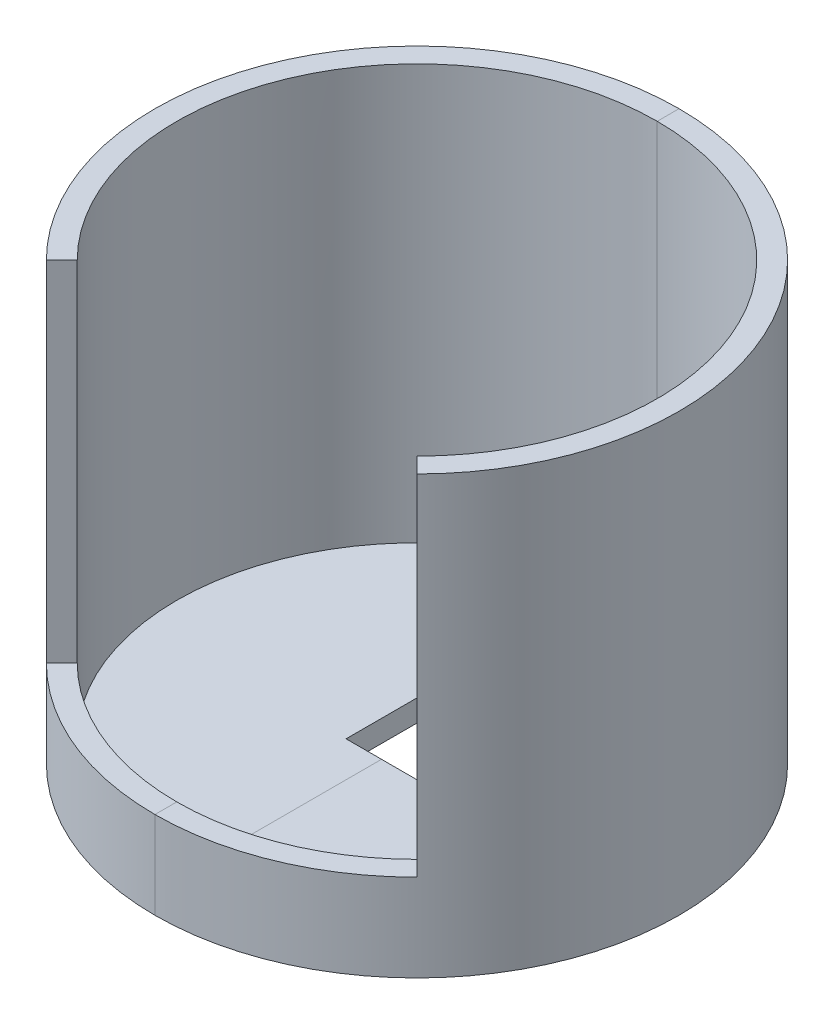
ISO-10303-21;
HEADER;
FILE_DESCRIPTION(('STEP AP214'),'2;1');
FILE_NAME('part.step','',(''),(''),'','','');
FILE_SCHEMA(('AUTOMOTIVE_DESIGN { 1 0 10303 214 1 1 1 1 }'));
ENDSEC;
DATA;
#1=APPLICATION_CONTEXT('core data for automotive mechanical design processes');
#2=APPLICATION_PROTOCOL_DEFINITION('international standard','automotive_design',2000,#1);
#3=PRODUCT_CONTEXT('',#1,'mechanical');
#4=PRODUCT('Part','Part','',(#3));
#5=PRODUCT_RELATED_PRODUCT_CATEGORY('part','',(#4));
#6=PRODUCT_DEFINITION_FORMATION('','',#4);
#7=PRODUCT_DEFINITION_CONTEXT('part definition',#1,'design');
#8=PRODUCT_DEFINITION('design','',#6,#7);
#9=PRODUCT_DEFINITION_SHAPE('','',#8);
#10=(LENGTH_UNIT() NAMED_UNIT(*) SI_UNIT(.MILLI.,.METRE.));
#11=(NAMED_UNIT(*) PLANE_ANGLE_UNIT() SI_UNIT($,.RADIAN.));
#12=(NAMED_UNIT(*) SI_UNIT($,.STERADIAN.) SOLID_ANGLE_UNIT());
#13=UNCERTAINTY_MEASURE_WITH_UNIT(LENGTH_MEASURE(1.E-05),#10,'distance_accuracy_value','');
#14=(GEOMETRIC_REPRESENTATION_CONTEXT(3) GLOBAL_UNCERTAINTY_ASSIGNED_CONTEXT((#13)) GLOBAL_UNIT_ASSIGNED_CONTEXT((#10,
#11,#12)) REPRESENTATION_CONTEXT('',''));
#15=CARTESIAN_POINT('',(0.,0.,0.));
#16=DIRECTION('',(0.,0.,1.));
#17=DIRECTION('',(1.,0.,0.));
#18=AXIS2_PLACEMENT_3D('',#15,#16,#17);
#19=CARTESIAN_POINT('',(0.,0.,0.));
#20=DIRECTION('',(1.,0.,0.));
#21=DIRECTION('',(0.,0.,-1.));
#22=AXIS2_PLACEMENT_3D('',#19,#20,#21);
#23=PLANE('',#22);
#24=DIRECTION('',(0.,0.,-1.));
#25=VECTOR('',#24,1.);
#26=CARTESIAN_POINT('',(0.,0.,0.));
#27=LINE('',#26,#25);
#28=CARTESIAN_POINT('',(0.,0.,-20.6375));
#29=VERTEX_POINT('',#28);
#30=CARTESIAN_POINT('',(0.,0.,-139.7));
#31=VERTEX_POINT('',#30);
#32=EDGE_CURVE('E165',#29,#31,#27,.T.);
#33=ORIENTED_EDGE('',*,*,#32,.F.);
#34=DIRECTION('',(0.,-1.,0.));
#35=VECTOR('',#34,1.);
#36=CARTESIAN_POINT('',(0.,12.7,-20.6375));
#37=LINE('',#36,#35);
#38=CARTESIAN_POINT('',(0.,12.7,-20.6375));
#39=VERTEX_POINT('',#38);
#40=EDGE_CURVE('E161',#39,#29,#37,.T.);
#41=ORIENTED_EDGE('',*,*,#40,.F.);
#42=DIRECTION('',(0.,0.,-1.));
#43=VECTOR('',#42,1.);
#44=CARTESIAN_POINT('',(0.,12.7,0.));
#45=LINE('',#44,#43);
#46=CARTESIAN_POINT('',(0.,12.7,-139.7));
#47=VERTEX_POINT('',#46);
#48=EDGE_CURVE('E81',#39,#47,#45,.T.);
#49=ORIENTED_EDGE('',*,*,#48,.T.);
#50=DIRECTION('',(0.,-1.,0.));
#51=VECTOR('',#50,1.);
#52=CARTESIAN_POINT('',(0.,12.7,-139.7));
#53=LINE('',#52,#51);
#54=EDGE_CURVE('E76',#31,#47,#53,.F.);
#55=ORIENTED_EDGE('',*,*,#54,.F.);
#56=EDGE_LOOP('',(#33,#41,#49,#55));
#57=FACE_BOUND('',#56,.T.);
#58=ADVANCED_FACE('F73',(#57),#23,.F.);
#59=CARTESIAN_POINT('',(0.,12.7,139.7));
#60=VERTEX_POINT('',#59);
#61=CARTESIAN_POINT('',(0.,12.7,20.6375));
#62=VERTEX_POINT('',#61);
#63=EDGE_CURVE('E167',#60,#62,#45,.T.);
#64=ORIENTED_EDGE('',*,*,#63,.T.);
#65=DIRECTION('',(0.,-1.,0.));
#66=VECTOR('',#65,1.);
#67=CARTESIAN_POINT('',(0.,12.7,20.6375));
#68=LINE('',#67,#66);
#69=CARTESIAN_POINT('',(0.,0.,20.6375));
#70=VERTEX_POINT('',#69);
#71=EDGE_CURVE('E14',#62,#70,#68,.T.);
#72=ORIENTED_EDGE('',*,*,#71,.T.);
#73=CARTESIAN_POINT('',(0.,0.,139.7));
#74=VERTEX_POINT('',#73);
#75=EDGE_CURVE('E89',#74,#70,#27,.T.);
#76=ORIENTED_EDGE('',*,*,#75,.F.);
#77=DIRECTION('',(0.,-1.,0.));
#78=VECTOR('',#77,1.);
#79=CARTESIAN_POINT('',(0.,12.7,139.7));
#80=LINE('',#79,#78);
#81=EDGE_CURVE('E168',#60,#74,#80,.T.);
#82=ORIENTED_EDGE('',*,*,#81,.F.);
#83=EDGE_LOOP('',(#64,#72,#76,#82));
#84=FACE_BOUND('',#83,.T.);
#85=ADVANCED_FACE('F177',(#84),#23,.F.);
#86=CARTESIAN_POINT('',(0.,12.7,0.));
#87=DIRECTION('',(0.,-1.,0.));
#88=DIRECTION('',(0.,0.,-1.));
#89=AXIS2_PLACEMENT_3D('',#86,#87,#88);
#90=CYLINDRICAL_SURFACE('',#89,139.7);
#91=CARTESIAN_POINT('',(0.,12.7,0.));
#92=DIRECTION('',(0.,1.,0.));
#93=DIRECTION('',(0.,0.,1.));
#94=AXIS2_PLACEMENT_3D('',#91,#92,#93);
#95=CIRCLE('',#94,139.7);
#96=EDGE_CURVE('E159',#60,#47,#95,.T.);
#97=ORIENTED_EDGE('',*,*,#96,.F.);
#98=ORIENTED_EDGE('',*,*,#81,.T.);
#99=CARTESIAN_POINT('',(0.,0.,0.));
#100=DIRECTION('',(0.,1.,0.));
#101=DIRECTION('',(0.,0.,1.));
#102=AXIS2_PLACEMENT_3D('',#99,#100,#101);
#103=CIRCLE('',#102,139.7);
#104=EDGE_CURVE('E154',#74,#31,#103,.T.);
#105=ORIENTED_EDGE('',*,*,#104,.T.);
#106=ORIENTED_EDGE('',*,*,#54,.T.);
#107=EDGE_LOOP('',(#97,#98,#105,#106));
#108=FACE_BOUND('',#107,.T.);
#109=ADVANCED_FACE('F175',(#108),#90,.T.);
#110=CARTESIAN_POINT('',(0.,12.7,0.));
#111=DIRECTION('',(0.,1.,0.));
#112=DIRECTION('',(0.,0.,1.));
#113=AXIS2_PLACEMENT_3D('',#110,#111,#112);
#114=PLANE('',#113);
#115=ORIENTED_EDGE('',*,*,#63,.F.);
#116=ORIENTED_EDGE('',*,*,#96,.T.);
#117=ORIENTED_EDGE('',*,*,#48,.F.);
#118=DIRECTION('',(1.,0.,0.));
#119=VECTOR('',#118,1.);
#120=CARTESIAN_POINT('',(-20.6375,12.7,-20.6375));
#121=LINE('',#120,#119);
#122=CARTESIAN_POINT('',(20.6375,12.7,-20.6375));
#123=VERTEX_POINT('',#122);
#124=EDGE_CURVE('E126',#39,#123,#121,.T.);
#125=ORIENTED_EDGE('',*,*,#124,.T.);
#126=DIRECTION('',(0.,0.,-1.));
#127=VECTOR('',#126,1.);
#128=CARTESIAN_POINT('',(20.6375,12.7,20.6375));
#129=LINE('',#128,#127);
#130=CARTESIAN_POINT('',(20.6375,12.7,20.6375));
#131=VERTEX_POINT('',#130);
#132=EDGE_CURVE('E131',#131,#123,#129,.T.);
#133=ORIENTED_EDGE('',*,*,#132,.F.);
#134=DIRECTION('',(1.,0.,0.));
#135=VECTOR('',#134,1.);
#136=CARTESIAN_POINT('',(-20.6375,12.7,20.6375));
#137=LINE('',#136,#135);
#138=EDGE_CURVE('E148',#62,#131,#137,.T.);
#139=ORIENTED_EDGE('',*,*,#138,.F.);
#140=EDGE_LOOP('',(#115,#116,#117,#125,#133,#139));
#141=FACE_BOUND('',#140,.T.);
#142=ADVANCED_FACE('F129',(#141),#114,.T.);
#143=CARTESIAN_POINT('',(0.,0.,0.));
#144=DIRECTION('',(0.,1.,0.));
#145=DIRECTION('',(0.,0.,1.));
#146=AXIS2_PLACEMENT_3D('',#143,#144,#145);
#147=PLANE('',#146);
#148=ORIENTED_EDGE('',*,*,#104,.F.);
#149=ORIENTED_EDGE('',*,*,#75,.T.);
#150=DIRECTION('',(1.,0.,0.));
#151=VECTOR('',#150,1.);
#152=CARTESIAN_POINT('',(-20.6375,0.,20.6375));
#153=LINE('',#152,#151);
#154=CARTESIAN_POINT('',(20.6375,0.,20.6375));
#155=VERTEX_POINT('',#154);
#156=EDGE_CURVE('E137',#70,#155,#153,.T.);
#157=ORIENTED_EDGE('',*,*,#156,.T.);
#158=DIRECTION('',(0.,0.,-1.));
#159=VECTOR('',#158,1.);
#160=CARTESIAN_POINT('',(20.6375,0.,20.6375));
#161=LINE('',#160,#159);
#162=CARTESIAN_POINT('',(20.6375,0.,-20.6375));
#163=VERTEX_POINT('',#162);
#164=EDGE_CURVE('E179',#155,#163,#161,.T.);
#165=ORIENTED_EDGE('',*,*,#164,.T.);
#166=DIRECTION('',(1.,0.,0.));
#167=VECTOR('',#166,1.);
#168=CARTESIAN_POINT('',(-20.6375,0.,-20.6375));
#169=LINE('',#168,#167);
#170=EDGE_CURVE('E152',#29,#163,#169,.T.);
#171=ORIENTED_EDGE('',*,*,#170,.F.);
#172=ORIENTED_EDGE('',*,*,#32,.T.);
#173=EDGE_LOOP('',(#148,#149,#157,#165,#171,#172));
#174=FACE_BOUND('',#173,.T.);
#175=ADVANCED_FACE('F171',(#174),#147,.F.);
#176=CARTESIAN_POINT('',(-20.6375,12.7,-20.6375));
#177=DIRECTION('',(0.,0.,-1.));
#178=DIRECTION('',(-1.,0.,0.));
#179=AXIS2_PLACEMENT_3D('',#176,#177,#178);
#180=PLANE('',#179);
#181=ORIENTED_EDGE('',*,*,#124,.F.);
#182=ORIENTED_EDGE('',*,*,#40,.T.);
#183=ORIENTED_EDGE('',*,*,#170,.T.);
#184=DIRECTION('',(0.,-1.,0.));
#185=VECTOR('',#184,1.);
#186=CARTESIAN_POINT('',(20.6375,12.7,-20.6375));
#187=LINE('',#186,#185);
#188=EDGE_CURVE('E144',#123,#163,#187,.T.);
#189=ORIENTED_EDGE('',*,*,#188,.F.);
#190=EDGE_LOOP('',(#181,#182,#183,#189));
#191=FACE_BOUND('',#190,.T.);
#192=ADVANCED_FACE('F150',(#191),#180,.F.);
#193=CARTESIAN_POINT('',(-20.6375,12.7,20.6375));
#194=DIRECTION('',(0.,0.,-1.));
#195=DIRECTION('',(-1.,0.,0.));
#196=AXIS2_PLACEMENT_3D('',#193,#194,#195);
#197=PLANE('',#196);
#198=ORIENTED_EDGE('',*,*,#71,.F.);
#199=ORIENTED_EDGE('',*,*,#138,.T.);
#200=DIRECTION('',(0.,-1.,0.));
#201=VECTOR('',#200,1.);
#202=CARTESIAN_POINT('',(20.6375,12.7,20.6375));
#203=LINE('',#202,#201);
#204=EDGE_CURVE('E147',#131,#155,#203,.T.);
#205=ORIENTED_EDGE('',*,*,#204,.T.);
#206=ORIENTED_EDGE('',*,*,#156,.F.);
#207=EDGE_LOOP('',(#198,#199,#205,#206));
#208=FACE_BOUND('',#207,.T.);
#209=ADVANCED_FACE('F178',(#208),#197,.T.);
#210=CARTESIAN_POINT('',(20.6375,12.7,20.6375));
#211=DIRECTION('',(-1.,0.,0.));
#212=DIRECTION('',(0.,0.,1.));
#213=AXIS2_PLACEMENT_3D('',#210,#211,#212);
#214=PLANE('',#213);
#215=ORIENTED_EDGE('',*,*,#164,.F.);
#216=ORIENTED_EDGE('',*,*,#204,.F.);
#217=ORIENTED_EDGE('',*,*,#132,.T.);
#218=ORIENTED_EDGE('',*,*,#188,.T.);
#219=EDGE_LOOP('',(#215,#216,#217,#218));
#220=FACE_BOUND('',#219,.T.);
#221=ADVANCED_FACE('F143',(#220),#214,.T.);
#222=CLOSED_SHELL('',(#58,#85,#109,#142,#175,#192,#209,#221));
#223=MANIFOLD_SOLID_BREP('B2',#222);
#224=CARTESIAN_POINT('',(0.,0.,0.));
#225=DIRECTION('',(1.,0.,0.));
#226=DIRECTION('',(0.,0.,-1.));
#227=AXIS2_PLACEMENT_3D('',#224,#225,#226);
#228=PLANE('',#227);
#229=DIRECTION('',(0.,0.,-1.));
#230=VECTOR('',#229,1.);
#231=CARTESIAN_POINT('',(0.,0.,107.830177644923));
#232=LINE('',#231,#230);
#233=CARTESIAN_POINT('',(0.,0.,152.494899658551));
#234=VERTEX_POINT('',#233);
#235=CARTESIAN_POINT('',(0.,0.,139.794899658551));
#236=VERTEX_POINT('',#235);
#237=EDGE_CURVE('E346',#234,#236,#232,.T.);
#238=ORIENTED_EDGE('',*,*,#237,.F.);
#239=DIRECTION('',(0.,-1.,0.));
#240=VECTOR('',#239,1.);
#241=CARTESIAN_POINT('',(0.,0.,152.494899658551));
#242=LINE('',#241,#240);
#243=CARTESIAN_POINT('',(0.,50.8,152.494899658551));
#244=VERTEX_POINT('',#243);
#245=EDGE_CURVE('E345',#234,#244,#242,.F.);
#246=ORIENTED_EDGE('',*,*,#245,.T.);
#247=DIRECTION('',(0.,0.,-1.));
#248=VECTOR('',#247,1.);
#249=CARTESIAN_POINT('',(0.,50.8,107.830177644923));
#250=LINE('',#249,#248);
#251=CARTESIAN_POINT('',(0.,50.8,139.794899658551));
#252=VERTEX_POINT('',#251);
#253=EDGE_CURVE('E259',#244,#252,#250,.T.);
#254=ORIENTED_EDGE('',*,*,#253,.T.);
#255=DIRECTION('',(0.,-1.,0.));
#256=VECTOR('',#255,1.);
#257=CARTESIAN_POINT('',(0.,0.,139.794899658551));
#258=LINE('',#257,#256);
#259=EDGE_CURVE('E254',#236,#252,#258,.F.);
#260=ORIENTED_EDGE('',*,*,#259,.F.);
#261=EDGE_LOOP('',(#238,#246,#254,#260));
#262=FACE_BOUND('',#261,.T.);
#263=ADVANCED_FACE('F251',(#262),#228,.F.);
#264=DIRECTION('',(0.,0.,-1.));
#265=VECTOR('',#264,1.);
#266=CARTESIAN_POINT('',(0.,254.,107.830177644925));
#267=LINE('',#266,#265);
#268=CARTESIAN_POINT('',(0.,254.,-139.794899658551));
#269=VERTEX_POINT('',#268);
#270=CARTESIAN_POINT('',(0.,254.,-152.494899658551));
#271=VERTEX_POINT('',#270);
#272=EDGE_CURVE('E71',#269,#271,#267,.T.);
#273=ORIENTED_EDGE('',*,*,#272,.T.);
#274=DIRECTION('',(0.,-1.,0.));
#275=VECTOR('',#274,1.);
#276=CARTESIAN_POINT('',(0.,0.,-152.494899658551));
#277=LINE('',#276,#275);
#278=CARTESIAN_POINT('',(0.,0.,-152.494899658551));
#279=VERTEX_POINT('',#278);
#280=EDGE_CURVE('E267',#271,#279,#277,.T.);
#281=ORIENTED_EDGE('',*,*,#280,.T.);
#282=CARTESIAN_POINT('',(0.,0.,-139.794899658551));
#283=VERTEX_POINT('',#282);
#284=EDGE_CURVE('E342',#283,#279,#232,.T.);
#285=ORIENTED_EDGE('',*,*,#284,.F.);
#286=DIRECTION('',(0.,-1.,0.));
#287=VECTOR('',#286,1.);
#288=CARTESIAN_POINT('',(0.,0.,-139.794899658551));
#289=LINE('',#288,#287);
#290=EDGE_CURVE('E273',#269,#283,#289,.T.);
#291=ORIENTED_EDGE('',*,*,#290,.F.);
#292=EDGE_LOOP('',(#273,#281,#285,#291));
#293=FACE_BOUND('',#292,.T.);
#294=ADVANCED_FACE('F360',(#293),#228,.F.);
#295=CARTESIAN_POINT('',(0.,0.,0.));
#296=DIRECTION('',(0.,-1.,0.));
#297=DIRECTION('',(0.,0.,-1.));
#298=AXIS2_PLACEMENT_3D('',#295,#296,#297);
#299=CYLINDRICAL_SURFACE('',#298,139.794899658551);
#300=CARTESIAN_POINT('',(0.,0.,0.));
#301=DIRECTION('',(0.,-1.,0.));
#302=DIRECTION('',(0.,0.,-1.));
#303=AXIS2_PLACEMENT_3D('',#300,#301,#302);
#304=CIRCLE('',#303,139.794899658551);
#305=EDGE_CURVE('E341',#283,#236,#304,.T.);
#306=ORIENTED_EDGE('',*,*,#305,.T.);
#307=ORIENTED_EDGE('',*,*,#259,.T.);
#308=CARTESIAN_POINT('',(0.,50.8,0.));
#309=DIRECTION('',(0.,-1.,0.));
#310=DIRECTION('',(0.,0.,-1.));
#311=AXIS2_PLACEMENT_3D('',#308,#309,#310);
#312=CIRCLE('',#311,139.794899658551);
#313=CARTESIAN_POINT('',(98.8499215238542,50.8,98.8499215238541));
#314=VERTEX_POINT('',#313);
#315=EDGE_CURVE('E320',#314,#252,#312,.T.);
#316=ORIENTED_EDGE('',*,*,#315,.F.);
#317=DIRECTION('',(0.,1.,0.));
#318=VECTOR('',#317,1.);
#319=CARTESIAN_POINT('',(98.8499215238542,0.,98.8499215238542));
#320=LINE('',#319,#318);
#321=CARTESIAN_POINT('',(98.8499215238541,254.,98.8499215238542));
#322=VERTEX_POINT('',#321);
#323=EDGE_CURVE('E316',#314,#322,#320,.T.);
#324=ORIENTED_EDGE('',*,*,#323,.T.);
#325=CARTESIAN_POINT('',(0.,254.,0.));
#326=DIRECTION('',(0.,-1.,0.));
#327=DIRECTION('',(0.,0.,-1.));
#328=AXIS2_PLACEMENT_3D('',#325,#326,#327);
#329=CIRCLE('',#328,139.794899658551);
#330=EDGE_CURVE('E305',#269,#322,#329,.T.);
#331=ORIENTED_EDGE('',*,*,#330,.F.);
#332=ORIENTED_EDGE('',*,*,#290,.T.);
#333=EDGE_LOOP('',(#306,#307,#316,#324,#331,#332));
#334=FACE_BOUND('',#333,.T.);
#335=ADVANCED_FACE('F318',(#334),#299,.F.);
#336=CARTESIAN_POINT('',(107.830177644923,0.,107.830177644923));
#337=DIRECTION('',(0.,1.,0.));
#338=DIRECTION('',(0.,0.,1.));
#339=AXIS2_PLACEMENT_3D('',#336,#337,#338);
#340=PLANE('',#339);
#341=CARTESIAN_POINT('',(0.,0.,0.));
#342=DIRECTION('',(0.,-1.,0.));
#343=DIRECTION('',(0.,0.,-1.));
#344=AXIS2_PLACEMENT_3D('',#341,#342,#343);
#345=CIRCLE('',#344,152.494899658551);
#346=EDGE_CURVE('E338',#279,#234,#345,.T.);
#347=ORIENTED_EDGE('',*,*,#346,.T.);
#348=ORIENTED_EDGE('',*,*,#237,.T.);
#349=ORIENTED_EDGE('',*,*,#305,.F.);
#350=ORIENTED_EDGE('',*,*,#284,.T.);
#351=EDGE_LOOP('',(#347,#348,#349,#350));
#352=FACE_BOUND('',#351,.T.);
#353=ADVANCED_FACE('F359',(#352),#340,.F.);
#354=CARTESIAN_POINT('',(0.,0.,0.));
#355=DIRECTION('',(0.,-1.,0.));
#356=DIRECTION('',(0.,0.,-1.));
#357=AXIS2_PLACEMENT_3D('',#354,#355,#356);
#358=CYLINDRICAL_SURFACE('',#357,152.494899658551);
#359=ORIENTED_EDGE('',*,*,#245,.F.);
#360=ORIENTED_EDGE('',*,*,#346,.F.);
#361=ORIENTED_EDGE('',*,*,#280,.F.);
#362=CARTESIAN_POINT('',(0.,254.,0.));
#363=DIRECTION('',(0.,-1.,0.));
#364=DIRECTION('',(0.,0.,-1.));
#365=AXIS2_PLACEMENT_3D('',#362,#363,#364);
#366=CIRCLE('',#365,152.494899658551);
#367=CARTESIAN_POINT('',(107.830177644923,254.,107.830177644923));
#368=VERTEX_POINT('',#367);
#369=EDGE_CURVE('E313',#271,#368,#366,.T.);
#370=ORIENTED_EDGE('',*,*,#369,.T.);
#371=DIRECTION('',(0.,1.,0.));
#372=VECTOR('',#371,1.);
#373=CARTESIAN_POINT('',(107.830177644923,0.,107.830177644923));
#374=LINE('',#373,#372);
#375=CARTESIAN_POINT('',(107.830177644923,50.8,107.830177644923));
#376=VERTEX_POINT('',#375);
#377=EDGE_CURVE('E328',#376,#368,#374,.T.);
#378=ORIENTED_EDGE('',*,*,#377,.F.);
#379=CARTESIAN_POINT('',(0.,50.8,0.));
#380=DIRECTION('',(0.,-1.,0.));
#381=DIRECTION('',(0.,0.,-1.));
#382=AXIS2_PLACEMENT_3D('',#379,#380,#381);
#383=CIRCLE('',#382,152.494899658551);
#384=EDGE_CURVE('E335',#376,#244,#383,.T.);
#385=ORIENTED_EDGE('',*,*,#384,.T.);
#386=EDGE_LOOP('',(#359,#360,#361,#370,#378,#385));
#387=FACE_BOUND('',#386,.T.);
#388=ADVANCED_FACE('F357',(#387),#358,.T.);
#389=CARTESIAN_POINT('',(107.830177644923,50.8,107.830177644923));
#390=DIRECTION('',(0.,1.,0.));
#391=DIRECTION('',(0.,0.,1.));
#392=AXIS2_PLACEMENT_3D('',#389,#390,#391);
#393=PLANE('',#392);
#394=ORIENTED_EDGE('',*,*,#253,.F.);
#395=ORIENTED_EDGE('',*,*,#384,.F.);
#396=DIRECTION('',(-0.707106781186548,0.,-0.707106781186548));
#397=VECTOR('',#396,1.);
#398=CARTESIAN_POINT('',(107.830177644923,50.8,107.830177644923));
#399=LINE('',#398,#397);
#400=EDGE_CURVE('E312',#376,#314,#399,.T.);
#401=ORIENTED_EDGE('',*,*,#400,.T.);
#402=ORIENTED_EDGE('',*,*,#315,.T.);
#403=EDGE_LOOP('',(#394,#395,#401,#402));
#404=FACE_BOUND('',#403,.T.);
#405=ADVANCED_FACE('F356',(#404),#393,.T.);
#406=CARTESIAN_POINT('',(-107.830177644922,254.,107.830177644925));
#407=DIRECTION('',(0.,1.,0.));
#408=DIRECTION('',(0.,0.,1.));
#409=AXIS2_PLACEMENT_3D('',#406,#407,#408);
#410=PLANE('',#409);
#411=ORIENTED_EDGE('',*,*,#272,.F.);
#412=ORIENTED_EDGE('',*,*,#330,.T.);
#413=DIRECTION('',(-0.707106781186548,0.,-0.707106781186548));
#414=VECTOR('',#413,1.);
#415=CARTESIAN_POINT('',(107.830177644923,254.,107.830177644923));
#416=LINE('',#415,#414);
#417=EDGE_CURVE('E310',#368,#322,#416,.T.);
#418=ORIENTED_EDGE('',*,*,#417,.F.);
#419=ORIENTED_EDGE('',*,*,#369,.F.);
#420=EDGE_LOOP('',(#411,#412,#418,#419));
#421=FACE_BOUND('',#420,.T.);
#422=ADVANCED_FACE('F307',(#421),#410,.T.);
#423=CARTESIAN_POINT('',(0.,0.,0.));
#424=DIRECTION('',(-0.707106781186548,0.,0.707106781186548));
#425=DIRECTION('',(0.707106781186548,0.,0.707106781186548));
#426=AXIS2_PLACEMENT_3D('',#423,#424,#425);
#427=PLANE('',#426);
#428=ORIENTED_EDGE('',*,*,#323,.F.);
#429=ORIENTED_EDGE('',*,*,#400,.F.);
#430=ORIENTED_EDGE('',*,*,#377,.T.);
#431=ORIENTED_EDGE('',*,*,#417,.T.);
#432=EDGE_LOOP('',(#428,#429,#430,#431));
#433=FACE_BOUND('',#432,.T.);
#434=ADVANCED_FACE('F326',(#433),#427,.T.);
#435=CLOSED_SHELL('',(#263,#294,#335,#353,#388,#405,#422,#434));
#436=MANIFOLD_SOLID_BREP('B8',#435);
#437=CARTESIAN_POINT('',(0.,0.,0.));
#438=DIRECTION('',(1.,0.,0.));
#439=DIRECTION('',(0.,0.,-1.));
#440=AXIS2_PLACEMENT_3D('',#437,#438,#439);
#441=PLANE('',#440);
#442=DIRECTION('',(0.,0.,-1.));
#443=VECTOR('',#442,1.);
#444=CARTESIAN_POINT('',(0.,0.,0.));
#445=LINE('',#444,#443);
#446=CARTESIAN_POINT('',(0.,0.,-20.6375));
#447=VERTEX_POINT('',#446);
#448=CARTESIAN_POINT('',(0.,0.,-139.7));
#449=VERTEX_POINT('',#448);
#450=EDGE_CURVE('E500',#447,#449,#445,.T.);
#451=ORIENTED_EDGE('',*,*,#450,.T.);
#452=DIRECTION('',(0.,-1.,0.));
#453=VECTOR('',#452,1.);
#454=CARTESIAN_POINT('',(0.,12.7,-139.7));
#455=LINE('',#454,#453);
#456=CARTESIAN_POINT('',(0.,12.7,-139.7));
#457=VERTEX_POINT('',#456);
#458=EDGE_CURVE('E536',#449,#457,#455,.F.);
#459=ORIENTED_EDGE('',*,*,#458,.T.);
#460=DIRECTION('',(0.,0.,-1.));
#461=VECTOR('',#460,1.);
#462=CARTESIAN_POINT('',(0.,12.7,0.));
#463=LINE('',#462,#461);
#464=CARTESIAN_POINT('',(0.,12.7,-20.6375));
#465=VERTEX_POINT('',#464);
#466=EDGE_CURVE('E510',#465,#457,#463,.T.);
#467=ORIENTED_EDGE('',*,*,#466,.F.);
#468=DIRECTION('',(0.,-1.,0.));
#469=VECTOR('',#468,1.);
#470=CARTESIAN_POINT('',(0.,12.7,-20.6375));
#471=LINE('',#470,#469);
#472=EDGE_CURVE('E496',#465,#447,#471,.T.);
#473=ORIENTED_EDGE('',*,*,#472,.T.);
#474=EDGE_LOOP('',(#451,#459,#467,#473));
#475=FACE_BOUND('',#474,.T.);
#476=ADVANCED_FACE('F438',(#475),#441,.T.);
#477=CARTESIAN_POINT('',(0.,12.7,139.7));
#478=VERTEX_POINT('',#477);
#479=CARTESIAN_POINT('',(0.,12.7,20.6375));
#480=VERTEX_POINT('',#479);
#481=EDGE_CURVE('E531',#478,#480,#463,.T.);
#482=ORIENTED_EDGE('',*,*,#481,.F.);
#483=DIRECTION('',(0.,-1.,0.));
#484=VECTOR('',#483,1.);
#485=CARTESIAN_POINT('',(0.,12.7,139.7));
#486=LINE('',#485,#484);
#487=CARTESIAN_POINT('',(0.,0.,139.7));
#488=VERTEX_POINT('',#487);
#489=EDGE_CURVE('E534',#478,#488,#486,.T.);
#490=ORIENTED_EDGE('',*,*,#489,.T.);
#491=CARTESIAN_POINT('',(0.,0.,20.6375));
#492=VERTEX_POINT('',#491);
#493=EDGE_CURVE('E507',#488,#492,#445,.T.);
#494=ORIENTED_EDGE('',*,*,#493,.T.);
#495=DIRECTION('',(0.,-1.,0.));
#496=VECTOR('',#495,1.);
#497=CARTESIAN_POINT('',(0.,12.7,20.6375));
#498=LINE('',#497,#496);
#499=EDGE_CURVE('E470',#480,#492,#498,.T.);
#500=ORIENTED_EDGE('',*,*,#499,.F.);
#501=EDGE_LOOP('',(#482,#490,#494,#500));
#502=FACE_BOUND('',#501,.T.);
#503=ADVANCED_FACE('F539',(#502),#441,.T.);
#504=CARTESIAN_POINT('',(0.,12.7,0.));
#505=DIRECTION('',(0.,-1.,0.));
#506=DIRECTION('',(0.,0.,-1.));
#507=AXIS2_PLACEMENT_3D('',#504,#505,#506);
#508=CYLINDRICAL_SURFACE('',#507,139.7);
#509=ORIENTED_EDGE('',*,*,#489,.F.);
#510=CARTESIAN_POINT('',(0.,12.7,0.));
#511=DIRECTION('',(0.,1.,0.));
#512=DIRECTION('',(0.,0.,1.));
#513=AXIS2_PLACEMENT_3D('',#510,#511,#512);
#514=CIRCLE('',#513,139.7);
#515=EDGE_CURVE('E514',#457,#478,#514,.T.);
#516=ORIENTED_EDGE('',*,*,#515,.F.);
#517=ORIENTED_EDGE('',*,*,#458,.F.);
#518=CARTESIAN_POINT('',(0.,0.,0.));
#519=DIRECTION('',(0.,1.,0.));
#520=DIRECTION('',(0.,0.,1.));
#521=AXIS2_PLACEMENT_3D('',#518,#519,#520);
#522=CIRCLE('',#521,139.7);
#523=EDGE_CURVE('E503',#449,#488,#522,.T.);
#524=ORIENTED_EDGE('',*,*,#523,.T.);
#525=EDGE_LOOP('',(#509,#516,#517,#524));
#526=FACE_BOUND('',#525,.T.);
#527=ADVANCED_FACE('F542',(#526),#508,.T.);
#528=CARTESIAN_POINT('',(-20.6375,12.7,20.6375));
#529=DIRECTION('',(-1.,0.,0.));
#530=DIRECTION('',(0.,0.,1.));
#531=AXIS2_PLACEMENT_3D('',#528,#529,#530);
#532=PLANE('',#531);
#533=DIRECTION('',(0.,0.,-1.));
#534=VECTOR('',#533,1.);
#535=CARTESIAN_POINT('',(-20.6375,0.,20.6375));
#536=LINE('',#535,#534);
#537=CARTESIAN_POINT('',(-20.6375,0.,20.6375));
#538=VERTEX_POINT('',#537);
#539=CARTESIAN_POINT('',(-20.6375,0.,-20.6375));
#540=VERTEX_POINT('',#539);
#541=EDGE_CURVE('E522',#538,#540,#536,.T.);
#542=ORIENTED_EDGE('',*,*,#541,.T.);
#543=DIRECTION('',(0.,-1.,0.));
#544=VECTOR('',#543,1.);
#545=CARTESIAN_POINT('',(-20.6375,12.7,-20.6375));
#546=LINE('',#545,#544);
#547=CARTESIAN_POINT('',(-20.6375,12.7,-20.6375));
#548=VERTEX_POINT('',#547);
#549=EDGE_CURVE('E463',#548,#540,#546,.T.);
#550=ORIENTED_EDGE('',*,*,#549,.F.);
#551=DIRECTION('',(0.,0.,-1.));
#552=VECTOR('',#551,1.);
#553=CARTESIAN_POINT('',(-20.6375,12.7,20.6375));
#554=LINE('',#553,#552);
#555=CARTESIAN_POINT('',(-20.6375,12.7,20.6375));
#556=VERTEX_POINT('',#555);
#557=EDGE_CURVE('E521',#556,#548,#554,.T.);
#558=ORIENTED_EDGE('',*,*,#557,.F.);
#559=DIRECTION('',(0.,-1.,0.));
#560=VECTOR('',#559,1.);
#561=CARTESIAN_POINT('',(-20.6375,12.7,20.6375));
#562=LINE('',#561,#560);
#563=EDGE_CURVE('E455',#556,#538,#562,.T.);
#564=ORIENTED_EDGE('',*,*,#563,.T.);
#565=EDGE_LOOP('',(#542,#550,#558,#564));
#566=FACE_BOUND('',#565,.T.);
#567=ADVANCED_FACE('F546',(#566),#532,.F.);
#568=CARTESIAN_POINT('',(0.,0.,0.));
#569=DIRECTION('',(0.,1.,0.));
#570=DIRECTION('',(0.,0.,1.));
#571=AXIS2_PLACEMENT_3D('',#568,#569,#570);
#572=PLANE('',#571);
#573=ORIENTED_EDGE('',*,*,#493,.F.);
#574=ORIENTED_EDGE('',*,*,#523,.F.);
#575=ORIENTED_EDGE('',*,*,#450,.F.);
#576=DIRECTION('',(1.,0.,0.));
#577=VECTOR('',#576,1.);
#578=CARTESIAN_POINT('',(-20.6375,0.,-20.6375));
#579=LINE('',#578,#577);
#580=EDGE_CURVE('E249',#540,#447,#579,.T.);
#581=ORIENTED_EDGE('',*,*,#580,.F.);
#582=ORIENTED_EDGE('',*,*,#541,.F.);
#583=DIRECTION('',(1.,0.,0.));
#584=VECTOR('',#583,1.);
#585=CARTESIAN_POINT('',(-20.6375,0.,20.6375));
#586=LINE('',#585,#584);
#587=EDGE_CURVE('E447',#538,#492,#586,.T.);
#588=ORIENTED_EDGE('',*,*,#587,.T.);
#589=EDGE_LOOP('',(#573,#574,#575,#581,#582,#588));
#590=FACE_BOUND('',#589,.T.);
#591=ADVANCED_FACE('F502',(#590),#572,.F.);
#592=CARTESIAN_POINT('',(0.,12.7,0.));
#593=DIRECTION('',(0.,1.,0.));
#594=DIRECTION('',(0.,0.,1.));
#595=AXIS2_PLACEMENT_3D('',#592,#593,#594);
#596=PLANE('',#595);
#597=ORIENTED_EDGE('',*,*,#515,.T.);
#598=ORIENTED_EDGE('',*,*,#481,.T.);
#599=DIRECTION('',(1.,0.,0.));
#600=VECTOR('',#599,1.);
#601=CARTESIAN_POINT('',(-20.6375,12.7,20.6375));
#602=LINE('',#601,#600);
#603=EDGE_CURVE('E518',#556,#480,#602,.T.);
#604=ORIENTED_EDGE('',*,*,#603,.F.);
#605=ORIENTED_EDGE('',*,*,#557,.T.);
#606=DIRECTION('',(1.,0.,0.));
#607=VECTOR('',#606,1.);
#608=CARTESIAN_POINT('',(-20.6375,12.7,-20.6375));
#609=LINE('',#608,#607);
#610=EDGE_CURVE('E520',#548,#465,#609,.T.);
#611=ORIENTED_EDGE('',*,*,#610,.T.);
#612=ORIENTED_EDGE('',*,*,#466,.T.);
#613=EDGE_LOOP('',(#597,#598,#604,#605,#611,#612));
#614=FACE_BOUND('',#613,.T.);
#615=ADVANCED_FACE('F544',(#614),#596,.T.);
#616=CARTESIAN_POINT('',(-20.6375,12.7,20.6375));
#617=DIRECTION('',(0.,0.,-1.));
#618=DIRECTION('',(-1.,0.,0.));
#619=AXIS2_PLACEMENT_3D('',#616,#617,#618);
#620=PLANE('',#619);
#621=ORIENTED_EDGE('',*,*,#603,.T.);
#622=ORIENTED_EDGE('',*,*,#499,.T.);
#623=ORIENTED_EDGE('',*,*,#587,.F.);
#624=ORIENTED_EDGE('',*,*,#563,.F.);
#625=EDGE_LOOP('',(#621,#622,#623,#624));
#626=FACE_BOUND('',#625,.T.);
#627=ADVANCED_FACE('F440',(#626),#620,.T.);
#628=CARTESIAN_POINT('',(-20.6375,12.7,-20.6375));
#629=DIRECTION('',(0.,0.,-1.));
#630=DIRECTION('',(-1.,0.,0.));
#631=AXIS2_PLACEMENT_3D('',#628,#629,#630);
#632=PLANE('',#631);
#633=ORIENTED_EDGE('',*,*,#472,.F.);
#634=ORIENTED_EDGE('',*,*,#610,.F.);
#635=ORIENTED_EDGE('',*,*,#549,.T.);
#636=ORIENTED_EDGE('',*,*,#580,.T.);
#637=EDGE_LOOP('',(#633,#634,#635,#636));
#638=FACE_BOUND('',#637,.T.);
#639=ADVANCED_FACE('F494',(#638),#632,.F.);
#640=CLOSED_SHELL('',(#476,#503,#527,#567,#591,#615,#627,#639));
#641=MANIFOLD_SOLID_BREP('B65',#640);
#642=CARTESIAN_POINT('',(0.,0.,0.));
#643=DIRECTION('',(1.,0.,0.));
#644=DIRECTION('',(0.,0.,-1.));
#645=AXIS2_PLACEMENT_3D('',#642,#643,#644);
#646=PLANE('',#645);
#647=DIRECTION('',(0.,0.,-1.));
#648=VECTOR('',#647,1.);
#649=CARTESIAN_POINT('',(0.,0.,107.830177644923));
#650=LINE('',#649,#648);
#651=CARTESIAN_POINT('',(0.,0.,152.494899658551));
#652=VERTEX_POINT('',#651);
#653=CARTESIAN_POINT('',(0.,0.,139.794899658551));
#654=VERTEX_POINT('',#653);
#655=EDGE_CURVE('E686',#652,#654,#650,.T.);
#656=ORIENTED_EDGE('',*,*,#655,.T.);
#657=DIRECTION('',(0.,-1.,0.));
#658=VECTOR('',#657,1.);
#659=CARTESIAN_POINT('',(0.,0.,139.794899658551));
#660=LINE('',#659,#658);
#661=CARTESIAN_POINT('',(0.,50.8,139.794899658551));
#662=VERTEX_POINT('',#661);
#663=EDGE_CURVE('E670',#654,#662,#660,.F.);
#664=ORIENTED_EDGE('',*,*,#663,.T.);
#665=DIRECTION('',(0.,0.,-1.));
#666=VECTOR('',#665,1.);
#667=CARTESIAN_POINT('',(0.,50.8,107.830177644923));
#668=LINE('',#667,#666);
#669=CARTESIAN_POINT('',(0.,50.8,152.494899658551));
#670=VERTEX_POINT('',#669);
#671=EDGE_CURVE('E718',#670,#662,#668,.T.);
#672=ORIENTED_EDGE('',*,*,#671,.F.);
#673=DIRECTION('',(0.,-1.,0.));
#674=VECTOR('',#673,1.);
#675=CARTESIAN_POINT('',(0.,0.,152.494899658551));
#676=LINE('',#675,#674);
#677=EDGE_CURVE('E724',#652,#670,#676,.F.);
#678=ORIENTED_EDGE('',*,*,#677,.F.);
#679=EDGE_LOOP('',(#656,#664,#672,#678));
#680=FACE_BOUND('',#679,.T.);
#681=ADVANCED_FACE('F606',(#680),#646,.T.);
#682=DIRECTION('',(0.,0.,-1.));
#683=VECTOR('',#682,1.);
#684=CARTESIAN_POINT('',(0.,254.,107.830177644925));
#685=LINE('',#684,#683);
#686=CARTESIAN_POINT('',(0.,254.,-139.794899658551));
#687=VERTEX_POINT('',#686);
#688=CARTESIAN_POINT('',(0.,254.,-152.494899658551));
#689=VERTEX_POINT('',#688);
#690=EDGE_CURVE('E677',#687,#689,#685,.T.);
#691=ORIENTED_EDGE('',*,*,#690,.F.);
#692=DIRECTION('',(0.,-1.,0.));
#693=VECTOR('',#692,1.);
#694=CARTESIAN_POINT('',(0.,0.,-139.794899658551));
#695=LINE('',#694,#693);
#696=CARTESIAN_POINT('',(0.,0.,-139.794899658551));
#697=VERTEX_POINT('',#696);
#698=EDGE_CURVE('E666',#687,#697,#695,.T.);
#699=ORIENTED_EDGE('',*,*,#698,.T.);
#700=CARTESIAN_POINT('',(0.,0.,-152.494899658551));
#701=VERTEX_POINT('',#700);
#702=EDGE_CURVE('E683',#697,#701,#650,.T.);
#703=ORIENTED_EDGE('',*,*,#702,.T.);
#704=DIRECTION('',(0.,-1.,0.));
#705=VECTOR('',#704,1.);
#706=CARTESIAN_POINT('',(0.,0.,-152.494899658551));
#707=LINE('',#706,#705);
#708=EDGE_CURVE('E721',#689,#701,#707,.T.);
#709=ORIENTED_EDGE('',*,*,#708,.F.);
#710=EDGE_LOOP('',(#691,#699,#703,#709));
#711=FACE_BOUND('',#710,.T.);
#712=ADVANCED_FACE('F681',(#711),#646,.T.);
#713=CARTESIAN_POINT('',(107.830177644923,0.,107.830177644923));
#714=DIRECTION('',(0.,1.,0.));
#715=DIRECTION('',(0.,0.,1.));
#716=AXIS2_PLACEMENT_3D('',#713,#714,#715);
#717=PLANE('',#716);
#718=ORIENTED_EDGE('',*,*,#655,.F.);
#719=CARTESIAN_POINT('',(0.,0.,0.));
#720=DIRECTION('',(0.,-1.,0.));
#721=DIRECTION('',(0.,0.,-1.));
#722=AXIS2_PLACEMENT_3D('',#719,#720,#721);
#723=CIRCLE('',#722,152.494899658551);
#724=EDGE_CURVE('E676',#652,#701,#723,.T.);
#725=ORIENTED_EDGE('',*,*,#724,.T.);
#726=ORIENTED_EDGE('',*,*,#702,.F.);
#727=CARTESIAN_POINT('',(0.,0.,0.));
#728=DIRECTION('',(0.,-1.,0.));
#729=DIRECTION('',(0.,0.,-1.));
#730=AXIS2_PLACEMENT_3D('',#727,#728,#729);
#731=CIRCLE('',#730,139.794899658551);
#732=EDGE_CURVE('E663',#654,#697,#731,.T.);
#733=ORIENTED_EDGE('',*,*,#732,.F.);
#734=EDGE_LOOP('',(#718,#725,#726,#733));
#735=FACE_BOUND('',#734,.T.);
#736=ADVANCED_FACE('F688',(#735),#717,.F.);
#737=CARTESIAN_POINT('',(0.,0.,0.));
#738=DIRECTION('',(-0.707106781186557,0.,-0.707106781186538));
#739=DIRECTION('',(-0.707106781186538,0.,0.707106781186557));
#740=AXIS2_PLACEMENT_3D('',#737,#738,#739);
#741=PLANE('',#740);
#742=DIRECTION('',(0.707106781186548,0.,-0.707106781186548));
#743=VECTOR('',#742,1.);
#744=CARTESIAN_POINT('',(-107.830177644923,50.8,107.830177644923));
#745=LINE('',#744,#743);
#746=CARTESIAN_POINT('',(-107.830177644922,50.8,107.830177644925));
#747=VERTEX_POINT('',#746);
#748=CARTESIAN_POINT('',(-98.8499215238528,50.8,98.8499215238555));
#749=VERTEX_POINT('',#748);
#750=EDGE_CURVE('E702',#747,#749,#745,.T.);
#751=ORIENTED_EDGE('',*,*,#750,.T.);
#752=DIRECTION('',(0.,1.,0.));
#753=VECTOR('',#752,1.);
#754=CARTESIAN_POINT('',(-98.8499215238528,0.,98.8499215238556));
#755=LINE('',#754,#753);
#756=CARTESIAN_POINT('',(-98.8499215238528,254.,98.8499215238555));
#757=VERTEX_POINT('',#756);
#758=EDGE_CURVE('E436',#749,#757,#755,.T.);
#759=ORIENTED_EDGE('',*,*,#758,.T.);
#760=DIRECTION('',(0.707106781186538,0.,-0.707106781186557));
#761=VECTOR('',#760,1.);
#762=CARTESIAN_POINT('',(-107.830177644922,254.,107.830177644925));
#763=LINE('',#762,#761);
#764=CARTESIAN_POINT('',(-107.830177644922,254.,107.830177644925));
#765=VERTEX_POINT('',#764);
#766=EDGE_CURVE('E616',#765,#757,#763,.T.);
#767=ORIENTED_EDGE('',*,*,#766,.F.);
#768=DIRECTION('',(0.,1.,0.));
#769=VECTOR('',#768,1.);
#770=CARTESIAN_POINT('',(-107.830177644922,0.,107.830177644925));
#771=LINE('',#770,#769);
#772=EDGE_CURVE('E630',#747,#765,#771,.T.);
#773=ORIENTED_EDGE('',*,*,#772,.F.);
#774=EDGE_LOOP('',(#751,#759,#767,#773));
#775=FACE_BOUND('',#774,.T.);
#776=ADVANCED_FACE('F733',(#775),#741,.F.);
#777=CARTESIAN_POINT('',(0.,0.,0.));
#778=DIRECTION('',(0.,-1.,0.));
#779=DIRECTION('',(0.,0.,-1.));
#780=AXIS2_PLACEMENT_3D('',#777,#778,#779);
#781=CYLINDRICAL_SURFACE('',#780,152.494899658551);
#782=ORIENTED_EDGE('',*,*,#724,.F.);
#783=ORIENTED_EDGE('',*,*,#677,.T.);
#784=CARTESIAN_POINT('',(0.,50.8,0.));
#785=DIRECTION('',(0.,-1.,0.));
#786=DIRECTION('',(0.,0.,-1.));
#787=AXIS2_PLACEMENT_3D('',#784,#785,#786);
#788=CIRCLE('',#787,152.494899658551);
#789=EDGE_CURVE('E697',#670,#747,#788,.T.);
#790=ORIENTED_EDGE('',*,*,#789,.T.);
#791=ORIENTED_EDGE('',*,*,#772,.T.);
#792=CARTESIAN_POINT('',(0.,254.,0.));
#793=DIRECTION('',(0.,-1.,0.));
#794=DIRECTION('',(0.,0.,-1.));
#795=AXIS2_PLACEMENT_3D('',#792,#793,#794);
#796=CIRCLE('',#795,152.494899658551);
#797=EDGE_CURVE('E610',#765,#689,#796,.T.);
#798=ORIENTED_EDGE('',*,*,#797,.T.);
#799=ORIENTED_EDGE('',*,*,#708,.T.);
#800=EDGE_LOOP('',(#782,#783,#790,#791,#798,#799));
#801=FACE_BOUND('',#800,.T.);
#802=ADVANCED_FACE('F732',(#801),#781,.T.);
#803=CARTESIAN_POINT('',(0.,0.,0.));
#804=DIRECTION('',(0.,-1.,0.));
#805=DIRECTION('',(0.,0.,-1.));
#806=AXIS2_PLACEMENT_3D('',#803,#804,#805);
#807=CYLINDRICAL_SURFACE('',#806,139.794899658551);
#808=ORIENTED_EDGE('',*,*,#663,.F.);
#809=ORIENTED_EDGE('',*,*,#732,.T.);
#810=ORIENTED_EDGE('',*,*,#698,.F.);
#811=CARTESIAN_POINT('',(0.,254.,0.));
#812=DIRECTION('',(0.,-1.,0.));
#813=DIRECTION('',(0.,0.,-1.));
#814=AXIS2_PLACEMENT_3D('',#811,#812,#813);
#815=CIRCLE('',#814,139.794899658551);
#816=EDGE_CURVE('E703',#757,#687,#815,.T.);
#817=ORIENTED_EDGE('',*,*,#816,.F.);
#818=ORIENTED_EDGE('',*,*,#758,.F.);
#819=CARTESIAN_POINT('',(0.,50.8,0.));
#820=DIRECTION('',(0.,-1.,0.));
#821=DIRECTION('',(0.,0.,-1.));
#822=AXIS2_PLACEMENT_3D('',#819,#820,#821);
#823=CIRCLE('',#822,139.794899658551);
#824=EDGE_CURVE('E700',#662,#749,#823,.T.);
#825=ORIENTED_EDGE('',*,*,#824,.F.);
#826=EDGE_LOOP('',(#808,#809,#810,#817,#818,#825));
#827=FACE_BOUND('',#826,.T.);
#828=ADVANCED_FACE('F665',(#827),#807,.F.);
#829=CARTESIAN_POINT('',(-107.830177644922,254.,107.830177644925));
#830=DIRECTION('',(0.,1.,0.));
#831=DIRECTION('',(0.,0.,1.));
#832=AXIS2_PLACEMENT_3D('',#829,#830,#831);
#833=PLANE('',#832);
#834=ORIENTED_EDGE('',*,*,#816,.T.);
#835=ORIENTED_EDGE('',*,*,#690,.T.);
#836=ORIENTED_EDGE('',*,*,#797,.F.);
#837=ORIENTED_EDGE('',*,*,#766,.T.);
#838=EDGE_LOOP('',(#834,#835,#836,#837));
#839=FACE_BOUND('',#838,.T.);
#840=ADVANCED_FACE('F608',(#839),#833,.T.);
#841=CARTESIAN_POINT('',(107.830177644923,50.8,107.830177644923));
#842=DIRECTION('',(0.,1.,0.));
#843=DIRECTION('',(0.,0.,1.));
#844=AXIS2_PLACEMENT_3D('',#841,#842,#843);
#845=PLANE('',#844);
#846=ORIENTED_EDGE('',*,*,#789,.F.);
#847=ORIENTED_EDGE('',*,*,#671,.T.);
#848=ORIENTED_EDGE('',*,*,#824,.T.);
#849=ORIENTED_EDGE('',*,*,#750,.F.);
#850=EDGE_LOOP('',(#846,#847,#848,#849));
#851=FACE_BOUND('',#850,.T.);
#852=ADVANCED_FACE('F731',(#851),#845,.T.);
#853=CLOSED_SHELL('',(#681,#712,#736,#776,#802,#828,#840,#852));
#854=MANIFOLD_SOLID_BREP('B243',#853);
#855=ADVANCED_BREP_SHAPE_REPRESENTATION('',(#18,#223,#436,#641,#854),#14);
#856=SHAPE_DEFINITION_REPRESENTATION(#9,#855);
ENDSEC;
END-ISO-10303-21;
